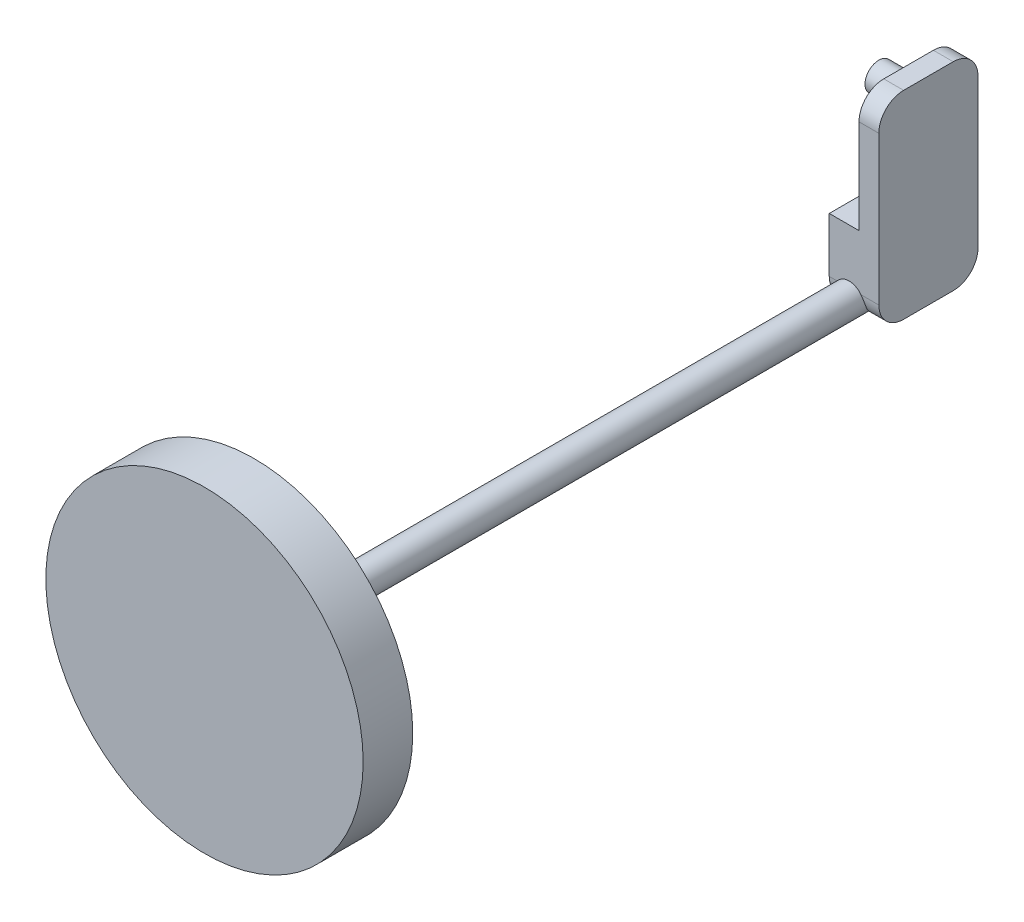
ISO-10303-21;
HEADER;
FILE_DESCRIPTION(('STEP AP214'),'2;1');
FILE_NAME('part.step','',(''),(''),'','','');
FILE_SCHEMA(('AUTOMOTIVE_DESIGN { 1 0 10303 214 1 1 1 1 }'));
ENDSEC;
DATA;
#1=APPLICATION_CONTEXT('core data for automotive mechanical design processes');
#2=APPLICATION_PROTOCOL_DEFINITION('international standard','automotive_design',2000,#1);
#3=PRODUCT_CONTEXT('',#1,'mechanical');
#4=PRODUCT('Part','Part','',(#3));
#5=PRODUCT_RELATED_PRODUCT_CATEGORY('part','',(#4));
#6=PRODUCT_DEFINITION_FORMATION('','',#4);
#7=PRODUCT_DEFINITION_CONTEXT('part definition',#1,'design');
#8=PRODUCT_DEFINITION('design','',#6,#7);
#9=PRODUCT_DEFINITION_SHAPE('','',#8);
#10=(LENGTH_UNIT() NAMED_UNIT(*) SI_UNIT(.MILLI.,.METRE.));
#11=(NAMED_UNIT(*) PLANE_ANGLE_UNIT() SI_UNIT($,.RADIAN.));
#12=(NAMED_UNIT(*) SI_UNIT($,.STERADIAN.) SOLID_ANGLE_UNIT());
#13=UNCERTAINTY_MEASURE_WITH_UNIT(LENGTH_MEASURE(1.E-05),#10,'distance_accuracy_value','');
#14=(GEOMETRIC_REPRESENTATION_CONTEXT(3) GLOBAL_UNCERTAINTY_ASSIGNED_CONTEXT((#13)) GLOBAL_UNIT_ASSIGNED_CONTEXT((#10,
#11,#12)) REPRESENTATION_CONTEXT('',''));
#15=CARTESIAN_POINT('',(0.,0.,0.));
#16=DIRECTION('',(0.,0.,1.));
#17=DIRECTION('',(1.,0.,0.));
#18=AXIS2_PLACEMENT_3D('',#15,#16,#17);
#19=CARTESIAN_POINT('',(25.0000000000001,460.,-1750.));
#20=DIRECTION('',(1.,0.,0.));
#21=DIRECTION('',(0.,1.,0.));
#22=AXIS2_PLACEMENT_3D('',#19,#20,#21);
#23=PLANE('',#22);
#24=CARTESIAN_POINT('',(25.,60.,-1687.5));
#25=DIRECTION('',(1.,0.,0.));
#26=DIRECTION('',(0.,1.,0.));
#27=AXIS2_PLACEMENT_3D('',#24,#25,#26);
#28=CIRCLE('',#27,18.7500000000001);
#29=CARTESIAN_POINT('',(25.,78.7500000000002,-1687.5));
#30=VERTEX_POINT('',#29);
#31=EDGE_CURVE('E190',#30,#30,#28,.F.);
#32=ORIENTED_EDGE('',*,*,#31,.F.);
#33=EDGE_LOOP('',(#32));
#34=FACE_BOUND('',#33,.T.);
#35=DIRECTION('',(0.,1.,0.));
#36=VECTOR('',#35,1.);
#37=CARTESIAN_POINT('',(25.0000000000001,460.,-1750.));
#38=LINE('',#37,#36);
#39=CARTESIAN_POINT('',(25.,22.5,-1750.));
#40=VERTEX_POINT('',#39);
#41=CARTESIAN_POINT('',(25.,397.5,-1750.));
#42=VERTEX_POINT('',#41);
#43=EDGE_CURVE('E160',#40,#42,#38,.T.);
#44=ORIENTED_EDGE('',*,*,#43,.F.);
#45=CARTESIAN_POINT('',(25.,22.5,-1687.5));
#46=DIRECTION('',(1.,0.,0.));
#47=DIRECTION('',(0.,1.,0.));
#48=AXIS2_PLACEMENT_3D('',#45,#46,#47);
#49=CIRCLE('',#48,62.5);
#50=CARTESIAN_POINT('',(25.,-40.,-1687.5));
#51=VERTEX_POINT('',#50);
#52=EDGE_CURVE('E225',#40,#51,#49,.F.);
#53=ORIENTED_EDGE('',*,*,#52,.T.);
#54=DIRECTION('',(0.,0.,1.));
#55=VECTOR('',#54,1.);
#56=CARTESIAN_POINT('',(25.,-40.,-1750.));
#57=LINE('',#56,#55);
#58=CARTESIAN_POINT('',(25.,-40.,-1625.));
#59=VERTEX_POINT('',#58);
#60=EDGE_CURVE('E165',#51,#59,#57,.T.);
#61=ORIENTED_EDGE('',*,*,#60,.T.);
#62=DIRECTION('',(0.,-1.,0.));
#63=VECTOR('',#62,1.);
#64=CARTESIAN_POINT('',(25.,-40.,-1625.));
#65=LINE('',#64,#63);
#66=CARTESIAN_POINT('',(25.,160.,-1625.));
#67=VERTEX_POINT('',#66);
#68=EDGE_CURVE('E138',#67,#59,#65,.T.);
#69=ORIENTED_EDGE('',*,*,#68,.F.);
#70=DIRECTION('',(0.,0.,-1.));
#71=VECTOR('',#70,1.);
#72=CARTESIAN_POINT('',(25.,160.,-1500.));
#73=LINE('',#72,#71);
#74=CARTESIAN_POINT('',(25.,160.,-1500.));
#75=VERTEX_POINT('',#74);
#76=EDGE_CURVE('E298',#75,#67,#73,.T.);
#77=ORIENTED_EDGE('',*,*,#76,.F.);
#78=DIRECTION('',(0.,1.,0.));
#79=VECTOR('',#78,1.);
#80=CARTESIAN_POINT('',(25.0000000000001,460.,-1500.));
#81=LINE('',#80,#79);
#82=CARTESIAN_POINT('',(25.,397.5,-1500.));
#83=VERTEX_POINT('',#82);
#84=EDGE_CURVE('E152',#75,#83,#81,.T.);
#85=ORIENTED_EDGE('',*,*,#84,.T.);
#86=CARTESIAN_POINT('',(25.,397.5,-1562.5));
#87=DIRECTION('',(1.,0.,0.));
#88=DIRECTION('',(0.,1.,0.));
#89=AXIS2_PLACEMENT_3D('',#86,#87,#88);
#90=CIRCLE('',#89,62.5);
#91=CARTESIAN_POINT('',(25.0000000000001,460.,-1562.5));
#92=VERTEX_POINT('',#91);
#93=EDGE_CURVE('E55',#83,#92,#90,.F.);
#94=ORIENTED_EDGE('',*,*,#93,.T.);
#95=DIRECTION('',(0.,0.,1.));
#96=VECTOR('',#95,1.);
#97=CARTESIAN_POINT('',(25.0000000000001,460.,-1750.));
#98=LINE('',#97,#96);
#99=CARTESIAN_POINT('',(25.0000000000001,460.,-1687.5));
#100=VERTEX_POINT('',#99);
#101=EDGE_CURVE('E176',#100,#92,#98,.T.);
#102=ORIENTED_EDGE('',*,*,#101,.F.);
#103=CARTESIAN_POINT('',(25.,397.5,-1687.5));
#104=DIRECTION('',(1.,0.,0.));
#105=DIRECTION('',(0.,1.,0.));
#106=AXIS2_PLACEMENT_3D('',#103,#104,#105);
#107=CIRCLE('',#106,62.5);
#108=EDGE_CURVE('E223',#100,#42,#107,.F.);
#109=ORIENTED_EDGE('',*,*,#108,.T.);
#110=EDGE_LOOP('',(#44,#53,#61,#69,#77,#85,#94,#102,#109));
#111=FACE_BOUND('',#110,.T.);
#112=CARTESIAN_POINT('',(25.,397.09,-1625.));
#113=DIRECTION('',(1.,0.,0.));
#114=DIRECTION('',(0.,1.,0.));
#115=AXIS2_PLACEMENT_3D('',#112,#113,#114);
#116=CIRCLE('',#115,34.9999999999999);
#117=CARTESIAN_POINT('',(25.0000000000001,432.09,-1625.));
#118=VERTEX_POINT('',#117);
#119=EDGE_CURVE('E193',#118,#118,#116,.F.);
#120=ORIENTED_EDGE('',*,*,#119,.F.);
#121=EDGE_LOOP('',(#120));
#122=FACE_BOUND('',#121,.T.);
#123=ADVANCED_FACE('F35',(#34,#111,#122),#23,.F.);
#124=CARTESIAN_POINT('',(0.,0.,0.));
#125=DIRECTION('',(0.,0.,1.));
#126=DIRECTION('',(1.,0.,0.));
#127=AXIS2_PLACEMENT_3D('',#124,#125,#126);
#128=PLANE('',#127);
#129=CARTESIAN_POINT('',(0.,0.,0.));
#130=DIRECTION('',(0.,0.,1.));
#131=DIRECTION('',(1.,0.,0.));
#132=AXIS2_PLACEMENT_3D('',#129,#130,#131);
#133=CIRCLE('',#132,400.);
#134=CARTESIAN_POINT('',(400.,0.,0.));
#135=VERTEX_POINT('',#134);
#136=EDGE_CURVE('E181',#135,#135,#133,.T.);
#137=ORIENTED_EDGE('',*,*,#136,.F.);
#138=EDGE_LOOP('',(#137));
#139=FACE_BOUND('',#138,.T.);
#140=CARTESIAN_POINT('',(0.,0.,0.));
#141=DIRECTION('',(0.,0.,1.));
#142=DIRECTION('',(1.,0.,0.));
#143=AXIS2_PLACEMENT_3D('',#140,#141,#142);
#144=CIRCLE('',#143,37.5);
#145=CARTESIAN_POINT('',(37.5,0.,0.));
#146=VERTEX_POINT('',#145);
#147=EDGE_CURVE('E185',#146,#146,#144,.F.);
#148=ORIENTED_EDGE('',*,*,#147,.F.);
#149=EDGE_LOOP('',(#148));
#150=FACE_BOUND('',#149,.T.);
#151=ADVANCED_FACE('F271',(#139,#150),#128,.F.);
#152=CARTESIAN_POINT('',(0.,0.,125.));
#153=DIRECTION('',(0.,0.,-1.));
#154=DIRECTION('',(-1.,0.,0.));
#155=AXIS2_PLACEMENT_3D('',#152,#153,#154);
#156=CYLINDRICAL_SURFACE('',#155,400.);
#157=CARTESIAN_POINT('',(0.,0.,125.));
#158=DIRECTION('',(0.,0.,1.));
#159=DIRECTION('',(1.,0.,0.));
#160=AXIS2_PLACEMENT_3D('',#157,#158,#159);
#161=CIRCLE('',#160,400.);
#162=CARTESIAN_POINT('',(400.,0.,125.));
#163=VERTEX_POINT('',#162);
#164=EDGE_CURVE('E182',#163,#163,#161,.T.);
#165=ORIENTED_EDGE('',*,*,#164,.F.);
#166=EDGE_LOOP('',(#165));
#167=FACE_BOUND('',#166,.T.);
#168=ORIENTED_EDGE('',*,*,#136,.T.);
#169=EDGE_LOOP('',(#168));
#170=FACE_BOUND('',#169,.T.);
#171=ADVANCED_FACE('F273',(#167,#170),#156,.T.);
#172=CARTESIAN_POINT('',(0.,0.,125.));
#173=DIRECTION('',(0.,0.,1.));
#174=DIRECTION('',(1.,0.,0.));
#175=AXIS2_PLACEMENT_3D('',#172,#173,#174);
#176=PLANE('',#175);
#177=ORIENTED_EDGE('',*,*,#164,.T.);
#178=EDGE_LOOP('',(#177));
#179=FACE_BOUND('',#178,.T.);
#180=ADVANCED_FACE('F268',(#179),#176,.T.);
#181=CARTESIAN_POINT('',(0.,0.,-1500.));
#182=DIRECTION('',(0.,0.,1.));
#183=DIRECTION('',(1.,0.,0.));
#184=AXIS2_PLACEMENT_3D('',#181,#182,#183);
#185=CYLINDRICAL_SURFACE('',#184,37.5);
#186=CARTESIAN_POINT('',(0.,0.,-1500.));
#187=DIRECTION('',(0.,0.,-1.));
#188=DIRECTION('',(-1.,0.,0.));
#189=AXIS2_PLACEMENT_3D('',#186,#187,#188);
#190=CIRCLE('',#189,37.5);
#191=CARTESIAN_POINT('',(-30.,22.5,-1500.));
#192=VERTEX_POINT('',#191);
#193=CARTESIAN_POINT('',(30.,22.5,-1500.));
#194=VERTEX_POINT('',#193);
#195=EDGE_CURVE('E178',#192,#194,#190,.T.);
#196=ORIENTED_EDGE('',*,*,#195,.F.);
#197=CARTESIAN_POINT('',(-30.,22.5,-1500.));
#198=CARTESIAN_POINT('',(-30.2830277402963,22.1226418896093,-1499.99999560788));
#199=CARTESIAN_POINT('',(-30.5589264224861,21.739931196325,-1500.00341754691));
#200=CARTESIAN_POINT('',(-31.0960442442056,20.9644549025037,-1500.01766360351));
#201=CARTESIAN_POINT('',(-31.3572627435669,20.5716888645621,-1500.02848804363));
#202=CARTESIAN_POINT('',(-31.8646314077851,19.7766952409566,-1500.05809206252));
#203=CARTESIAN_POINT('',(-32.1107781509119,19.3744655352438,-1500.07687344015));
#204=CARTESIAN_POINT('',(-32.5875175664519,18.5614084004606,-1500.1228936957));
#205=CARTESIAN_POINT('',(-32.8181104656962,18.1505810968887,-1500.15013245025));
#206=CARTESIAN_POINT('',(-33.4853688594126,16.9074878813422,-1500.24517558679));
#207=CARTESIAN_POINT('',(-33.8983427780615,16.063311094886,-1500.32635187836));
#208=CARTESIAN_POINT('',(-34.658225752377,14.3504507781838,-1500.52759841644));
#209=CARTESIAN_POINT('',(-35.0051426451553,13.4817701691686,-1500.64766404448));
#210=CARTESIAN_POINT('',(-35.6320723767928,11.7250514669539,-1500.92936364992));
#211=CARTESIAN_POINT('',(-35.9119449490466,10.8369769594044,-1501.09108333284));
#212=CARTESIAN_POINT('',(-36.4031847852706,9.05075824393393,-1501.45739909067));
#213=CARTESIAN_POINT('',(-36.6145491427832,8.15261361046032,-1501.66199698408));
#214=CARTESIAN_POINT('',(-36.969050932117,6.35441228510053,-1502.11433152124));
#215=CARTESIAN_POINT('',(-37.1122334407846,5.45435725275189,-1502.36203951539));
#216=CARTESIAN_POINT('',(-37.3320255676991,3.65894624728904,-1502.90014267286));
#217=CARTESIAN_POINT('',(-37.4086355524214,2.76359024833408,-1503.19053760117));
#218=CARTESIAN_POINT('',(-37.4972539305428,0.992443183157557,-1503.80973656853));
#219=CARTESIAN_POINT('',(-37.5098556184161,0.116547642863575,-1504.13815889284));
#220=CARTESIAN_POINT('',(-37.4751037541439,-1.61850233563737,-1504.83353331226));
#221=CARTESIAN_POINT('',(-37.4277518026215,-2.47765722015925,-1505.2004843785));
#222=CARTESIAN_POINT('',(-37.2766067205187,-4.17507291668848,-1505.97071667282));
#223=CARTESIAN_POINT('',(-37.1727744830336,-5.01331883026324,-1506.37402291157));
#224=CARTESIAN_POINT('',(-36.9124788011379,-6.66466241080007,-1507.21409961361));
#225=CARTESIAN_POINT('',(-36.756004891253,-7.47775504201545,-1507.65087671775));
#226=CARTESIAN_POINT('',(-36.4501210932634,-8.82950202482545,-1508.41565783467));
#227=CARTESIAN_POINT('',(-36.3133706116705,-9.37557198337042,-1508.73574499495));
#228=CARTESIAN_POINT('',(-36.0179257478082,-10.4532849419318,-1509.38947168483));
#229=CARTESIAN_POINT('',(-35.8592357907571,-10.9849308254977,-1509.7231084719));
#230=CARTESIAN_POINT('',(-35.3520145420788,-12.5578229128724,-1510.74325708231));
#231=CARTESIAN_POINT('',(-34.9723704773547,-13.576855971869,-1511.44891199542));
#232=CARTESIAN_POINT('',(-34.1394342831506,-15.5531705750891,-1512.90448264888));
#233=CARTESIAN_POINT('',(-33.6860389564623,-16.510362927383,-1513.65445945709));
#234=CARTESIAN_POINT('',(-32.7146238335169,-18.3601400952621,-1515.19096318473));
#235=CARTESIAN_POINT('',(-32.1966030143238,-19.252723887826,-1515.97749068257));
#236=CARTESIAN_POINT('',(-30.9144104320411,-21.2704070534774,-1517.85805095266));
#237=CARTESIAN_POINT('',(-30.1270123299817,-22.369352649361,-1518.96447567978));
#238=CARTESIAN_POINT('',(-28.8793726520209,-23.9306465599078,-1520.65463611748));
#239=CARTESIAN_POINT('',(-28.4522501925279,-24.4367099249897,-1521.2233031133));
#240=CARTESIAN_POINT('',(-27.5770876632547,-25.4202183743368,-1522.36930684359));
#241=CARTESIAN_POINT('',(-27.1290480614999,-25.8976640983823,-1522.94664338388));
#242=CARTESIAN_POINT('',(-26.2126016578798,-26.8248965964236,-1524.10913853271));
#243=CARTESIAN_POINT('',(-25.7441666146365,-27.2746427923984,-1524.69430715671));
#244=CARTESIAN_POINT('',(-24.7883734952078,-28.1461330055592,-1525.87003077102));
#245=CARTESIAN_POINT('',(-24.3010150497229,-28.5678764758227,-1526.46058586627));
#246=CARTESIAN_POINT('',(-23.3081209470279,-29.3835701813693,-1527.64512923496));
#247=CARTESIAN_POINT('',(-22.8025919052084,-29.7775303800704,-1528.23911619416));
#248=CARTESIAN_POINT('',(-21.7734263999333,-30.5381275544856,-1529.42878006766));
#249=CARTESIAN_POINT('',(-21.2497908718795,-30.9047659385975,-1530.02445689319));
#250=CARTESIAN_POINT('',(-19.9993786609116,-31.7335247186081,-1531.42197812006));
#251=CARTESIAN_POINT('',(-19.2651178224018,-32.1846750674615,-1532.22369550385));
#252=CARTESIAN_POINT('',(-18.1372122091725,-32.8249632081015,-1533.42073612928));
#253=CARTESIAN_POINT('',(-17.7567734753638,-33.0323442596832,-1533.81887844982));
#254=CARTESIAN_POINT('',(-16.9865336130084,-33.4349605793145,-1534.6122259277));
#255=CARTESIAN_POINT('',(-16.596732962211,-33.6301964653278,-1535.00743123357));
#256=CARTESIAN_POINT('',(-15.8085031731703,-34.0078155800716,-1535.79221595544));
#257=CARTESIAN_POINT('',(-15.4101098679721,-34.1902422661371,-1536.18181043408));
#258=CARTESIAN_POINT('',(-14.6024657593377,-34.5429033350092,-1536.95518163451));
#259=CARTESIAN_POINT('',(-14.1932157180783,-34.713138570606,-1537.33895876174));
#260=CARTESIAN_POINT('',(-13.3628221020428,-35.0411787128354,-1538.09848818795));
#261=CARTESIAN_POINT('',(-12.9416841051913,-35.1989893217039,-1538.47424410983));
#262=CARTESIAN_POINT('',(-12.0858259242665,-35.501956511884,-1539.21517426913));
#263=CARTESIAN_POINT('',(-11.6511078149525,-35.6471150134552,-1539.58035010669));
#264=CARTESIAN_POINT('',(-10.8594511170038,-35.8950707894862,-1540.22091697465));
#265=CARTESIAN_POINT('',(-10.5054617770135,-36.0003424931613,-1540.49899056235));
#266=CARTESIAN_POINT('',(-9.78655321916746,-36.2023868695126,-1541.04390150359));
#267=CARTESIAN_POINT('',(-9.42163444584671,-36.2991598872298,-1541.31073931306));
#268=CARTESIAN_POINT('',(-8.67836604495312,-36.4840111320178,-1541.83087293492));
#269=CARTESIAN_POINT('',(-8.29997943289465,-36.5720624234023,-1542.08412575183));
#270=CARTESIAN_POINT('',(-7.52927572766957,-36.738473525312,-1542.572137639));
#271=CARTESIAN_POINT('',(-7.13695789383411,-36.8168328195555,-1542.80689572381));
#272=CARTESIAN_POINT('',(-6.32969667478686,-36.9642573650385,-1543.25658373656));
#273=CARTESIAN_POINT('',(-5.91447228162339,-37.0331287044961,-1543.471077823));
#274=CARTESIAN_POINT('',(-5.06692316895651,-37.1585753737403,-1543.86809797706));
#275=CARTESIAN_POINT('',(-4.63459613752356,-37.2151490343708,-1544.05061970445));
#276=CARTESIAN_POINT('',(-3.75566407191048,-37.314063635612,-1544.37387867851));
#277=CARTESIAN_POINT('',(-3.30915709713589,-37.3564857174402,-1544.51485358016));
#278=CARTESIAN_POINT('',(-2.40222195114889,-37.4257324264104,-1544.74692855732));
#279=CARTESIAN_POINT('',(-1.94180708658736,-37.4525714948828,-1544.83807480621));
#280=CARTESIAN_POINT('',(-1.16801207318066,-37.4830869322276,-1544.94206655549));
#281=CARTESIAN_POINT('',(-0.85691462834911,-37.491506568804,-1544.97089987265));
#282=CARTESIAN_POINT('',(-0.233303382939208,-37.5005691775021,-1545.00194268646));
#283=CARTESIAN_POINT('',(0.0792100823132176,-37.5012139034243,-1545.00415818732));
#284=CARTESIAN_POINT('',(0.703329886315355,-37.4947035270938,-1544.98184746765));
#285=CARTESIAN_POINT('',(1.01493572984767,-37.4875447598596,-1544.95730868171));
#286=CARTESIAN_POINT('',(1.6347831419381,-37.4656338913591,-1544.88255861697));
#287=CARTESIAN_POINT('',(1.94302414033071,-37.4508805229909,-1544.83234305419));
#288=CARTESIAN_POINT('',(2.63612800496433,-37.4092427906499,-1544.69159253695));
#289=CARTESIAN_POINT('',(3.0193990896042,-37.3801675698335,-1544.59386058533));
#290=CARTESIAN_POINT('',(3.77510260093428,-37.3114299966365,-1544.36558625519));
#291=CARTESIAN_POINT('',(4.1475288203016,-37.2717617082073,-1544.23502548276));
#292=CARTESIAN_POINT('',(4.88154919146666,-37.1827596575477,-1543.94626561444));
#293=CARTESIAN_POINT('',(5.24310590677173,-37.1333961143797,-1543.78798152714));
#294=CARTESIAN_POINT('',(5.95417806444665,-37.0260323603589,-1543.44919805741));
#295=CARTESIAN_POINT('',(6.30369434978728,-36.9680327556508,-1543.26870023427));
#296=CARTESIAN_POINT('',(7.07336471644142,-36.829401187691,-1542.84464516976));
#297=CARTESIAN_POINT('',(7.49049618855889,-36.7466699504844,-1542.59631261164));
#298=CARTESIAN_POINT('',(8.30920105513574,-36.5702419259318,-1542.07865342364));
#299=CARTESIAN_POINT('',(8.71076811446963,-36.4765407346373,-1541.80931837679));
#300=CARTESIAN_POINT('',(9.50065334367476,-36.2788310865468,-1541.25415330303));
#301=CARTESIAN_POINT('',(9.88894892997522,-36.1748061321782,-1540.96829718971));
#302=CARTESIAN_POINT('',(10.6532053438466,-35.9571555617227,-1540.38421090355));
#303=CARTESIAN_POINT('',(11.0291678168019,-35.8435312335977,-1540.08598239345));
#304=CARTESIAN_POINT('',(11.7723125383759,-35.6063987759867,-1539.47819689198));
#305=CARTESIAN_POINT('',(12.1394339149506,-35.4828389184193,-1539.16858586733));
#306=CARTESIAN_POINT('',(12.8638795790968,-35.2266676158758,-1538.54177364339));
#307=CARTESIAN_POINT('',(13.2212037188728,-35.0940560344557,-1538.22457232973));
#308=CARTESIAN_POINT('',(14.2794354833675,-34.6831495240604,-1537.26469010831));
#309=CARTESIAN_POINT('',(14.9672460631804,-34.3915755405916,-1536.61319515428));
#310=CARTESIAN_POINT('',(16.2942028768555,-33.7826298734548,-1535.31515884197));
#311=CARTESIAN_POINT('',(16.9341763776188,-33.4662258397849,-1534.66900213773));
#312=CARTESIAN_POINT('',(18.1894665669865,-32.8008829438975,-1533.36933967715));
#313=CARTESIAN_POINT('',(18.8047797296938,-32.4519394527986,-1532.7158328869));
#314=CARTESIAN_POINT('',(20.0129329300853,-31.7211482400142,-1531.40529619488));
#315=CARTESIAN_POINT('',(20.6057538126584,-31.3392733401748,-1530.74826381098));
#316=CARTESIAN_POINT('',(21.7691735450593,-30.5425942095171,-1529.43455953738));
#317=CARTESIAN_POINT('',(22.3397735726759,-30.1277917275348,-1528.77788763039));
#318=CARTESIAN_POINT('',(23.4571831585728,-29.2661369099779,-1527.46960209578));
#319=CARTESIAN_POINT('',(24.0040593997749,-28.8193852157412,-1526.81797917912));
#320=CARTESIAN_POINT('',(25.0753735569452,-27.892247282806,-1525.52017516245));
#321=CARTESIAN_POINT('',(25.5998107719219,-27.4118599945714,-1524.87399423294));
#322=CARTESIAN_POINT('',(26.6249620004148,-26.4172502461003,-1523.58969432406));
#323=CARTESIAN_POINT('',(27.1256897607602,-25.9030478156358,-1522.95157083434));
#324=CARTESIAN_POINT('',(28.1022785781729,-24.8401439755898,-1521.6852458936));
#325=CARTESIAN_POINT('',(28.5781416661696,-24.2914453917216,-1521.05704363515));
#326=CARTESIAN_POINT('',(29.7050229794728,-22.9120973576543,-1519.54129123441));
#327=CARTESIAN_POINT('',(30.3419587446549,-22.0628148937015,-1518.66007264044));
#328=CARTESIAN_POINT('',(31.5542605339174,-20.2911464207609,-1516.92915931291));
#329=CARTESIAN_POINT('',(32.1296267157712,-19.3687605991127,-1516.07946449858));
#330=CARTESIAN_POINT('',(33.209988901159,-17.4515413004977,-1514.41953974806));
#331=CARTESIAN_POINT('',(33.7150438631121,-16.4567696006401,-1513.60927712202));
#332=CARTESIAN_POINT('',(34.6453478500079,-14.3954077155656,-1512.0355660069));
#333=CARTESIAN_POINT('',(35.0706154616459,-13.3288343356212,-1511.27210664284));
#334=CARTESIAN_POINT('',(35.7502644697192,-11.3584655860534,-1509.95527008598));
#335=CARTESIAN_POINT('',(36.0217773005013,-10.4675363136927,-1509.39144946639));
#336=CARTESIAN_POINT('',(36.5019136038629,-8.64565959038025,-1508.30292108635));
#337=CARTESIAN_POINT('',(36.7105438847632,-7.7147164842231,-1507.77820909624));
#338=CARTESIAN_POINT('',(37.0584965002085,-5.81778815487953,-1506.77295251213));
#339=CARTESIAN_POINT('',(37.1978866057205,-4.85183819355847,-1506.29236510699));
#340=CARTESIAN_POINT('',(37.4015074410105,-2.88963504299522,-1505.37918744563));
#341=CARTESIAN_POINT('',(37.4657375323134,-1.89338159640246,-1504.94659759716));
#342=CARTESIAN_POINT('',(37.5135354104608,0.130233627822795,-1504.13011715043));
#343=CARTESIAN_POINT('',(37.4964523046447,1.15778078700809,-1503.74664484212));
#344=CARTESIAN_POINT('',(37.3752540919652,3.22714581211328,-1503.03569229552));
#345=CARTESIAN_POINT('',(37.2711378561657,4.26896386297329,-1502.70821278359));
#346=CARTESIAN_POINT('',(36.9723298624495,6.35683028079837,-1502.11103180226));
#347=CARTESIAN_POINT('',(36.7775929065397,7.40288050022012,-1501.84135926282));
#348=CARTESIAN_POINT('',(36.2958745376803,9.48700865535526,-1501.36035803869));
#349=CARTESIAN_POINT('',(36.0089035087312,10.5250874750497,-1501.14902279117));
#350=CARTESIAN_POINT('',(35.3614505586092,12.5243426066538,-1500.79336517039));
#351=CARTESIAN_POINT('',(35.0059555865099,13.4865809993527,-1500.64596499353));
#352=CARTESIAN_POINT('',(34.4126213539252,14.9092628265143,-1500.46081781469));
#353=CARTESIAN_POINT('',(34.2047775473876,15.3801417655665,-1500.40508626942));
#354=CARTESIAN_POINT('',(33.7693806181591,16.3139242677161,-1500.3051228332));
#355=CARTESIAN_POINT('',(33.5418295876753,16.7768286711853,-1500.26088972352));
#356=CARTESIAN_POINT('',(33.0667125399435,17.6949296002719,-1500.18327489182));
#357=CARTESIAN_POINT('',(32.8190886718711,18.1500989182638,-1500.14992603493));
#358=CARTESIAN_POINT('',(32.3048877249461,19.0502733684079,-1500.09364804826));
#359=CARTESIAN_POINT('',(32.0383102884731,19.4952783085669,-1500.07071911514));
#360=CARTESIAN_POINT('',(31.4867896780237,20.3740291130517,-1500.03462129649));
#361=CARTESIAN_POINT('',(31.2018502777071,20.8077772652762,-1500.02145041244));
#362=CARTESIAN_POINT('',(30.6141498505758,21.6631790238701,-1500.00413645473));
#363=CARTESIAN_POINT('',(30.3113898232041,22.0848333065369,-1499.99999287529));
#364=CARTESIAN_POINT('',(30.,22.5,-1500.));
#365=B_SPLINE_CURVE_WITH_KNOTS('',3,(#197,#198,#199,#200,#201,#202,#203,#204,#205,#206,#207,
#208,#209,#210,#211,#212,#213,#214,#215,#216,#217,#218,#219,#220,#221,#222,#223,#224,#225,#226,
#227,#228,#229,#230,#231,#232,#233,#234,#235,#236,#237,#238,#239,#240,#241,#242,#243,#244,#245,
#246,#247,#248,#249,#250,#251,#252,#253,#254,#255,#256,#257,#258,#259,#260,#261,#262,#263,#264,
#265,#266,#267,#268,#269,#270,#271,#272,#273,#274,#275,#276,#277,#278,#279,#280,#281,#282,#283,
#284,#285,#286,#287,#288,#289,#290,#291,#292,#293,#294,#295,#296,#297,#298,#299,#300,#301,#302,
#303,#304,#305,#306,#307,#308,#309,#310,#311,#312,#313,#314,#315,#316,#317,#318,#319,#320,#321,
#322,#323,#324,#325,#326,#327,#328,#329,#330,#331,#332,#333,#334,#335,#336,#337,#338,#339,#340,
#341,#342,#343,#344,#345,#346,#347,#348,#349,#350,#351,#352,#353,#354,#355,#356,#357,#358,#359,
#360,#361,#362,#363,#364),.UNSPECIFIED.,.F.,.F.,(4,2,2,2,2,2,2,2,2,2,2,2,2,2,2,2,2,2,2,2,2,2,2,
2,2,2,2,2,2,2,2,2,2,2,2,2,2,2,2,2,2,2,2,2,2,2,2,2,2,2,2,2,2,2,2,2,2,2,2,2,2,2,2,2,2,2,2,2,2,2,2,
2,2,2,2,2,2,2,2,2,2,2,2,4),(0.,1.41501759637815,2.83009685055583,4.24549618700732,
5.66087487736841,8.48702085932883,11.3128313335858,14.1445031731499,16.9762951305305,
19.8062123061535,22.6361139032553,25.4397365790207,28.2432844061363,31.0487758830125,
33.8548254380279,35.79688243429,37.7385482852742,41.6224674854778,45.5118688024197,
49.4013316912491,54.6339960629855,57.2520590352761,59.8700634559178,62.4918160780694,
65.113619890732,67.7344786607592,70.3552022359353,73.8845868099696,75.6497376964007,
77.4147986957918,79.1735489362577,80.9321760320148,82.6899912496804,84.4475392106135,
85.8341341000298,87.2206726685728,88.6113679164592,90.0021372132291,91.4180815340855,
92.8342179203533,94.2420891190892,95.6486535025797,96.5851603881705,97.5214560202758,
98.4581915816771,99.3950834810126,100.582928471319,101.771440497501,102.963662044937,
104.15579995259,105.632119391131,107.109033551808,108.588347062467,110.06746240572,
111.554850842381,113.042261704589,116.014499199134,118.902337540769,121.790587318665,
124.681243996708,127.571747249984,130.453515527622,133.335373765594,136.215540101498,
139.095470818462,143.230936389683,147.366391363426,151.498357452702,155.62935979006,
158.892654765465,162.155596295486,165.41533779629,168.675106987989,171.961013530142,
175.246962695556,178.534552520539,181.821772347952,184.925829597691,186.478516639535,
188.031039042777,189.588206845689,191.145404037399,192.702282216022,194.259073162515),.UNSPECIFIED.);
#366=EDGE_CURVE('E11',#192,#194,#365,.T.);
#367=ORIENTED_EDGE('',*,*,#366,.T.);
#368=EDGE_LOOP('',(#196,#367));
#369=FACE_BOUND('',#368,.T.);
#370=ORIENTED_EDGE('',*,*,#147,.T.);
#371=EDGE_LOOP('',(#370));
#372=FACE_BOUND('',#371,.T.);
#373=ADVANCED_FACE('F265',(#369,#372),#185,.T.);
#374=CARTESIAN_POINT('',(25.0000000000001,460.,-1750.));
#375=DIRECTION('',(0.,-1.,0.));
#376=DIRECTION('',(0.,0.,-1.));
#377=AXIS2_PLACEMENT_3D('',#374,#375,#376);
#378=PLANE('',#377);
#379=DIRECTION('',(0.,0.,1.));
#380=VECTOR('',#379,1.);
#381=CARTESIAN_POINT('',(75.0000000000001,460.,-1750.));
#382=LINE('',#381,#380);
#383=CARTESIAN_POINT('',(75.0000000000001,460.,-1687.5));
#384=VERTEX_POINT('',#383);
#385=CARTESIAN_POINT('',(75.0000000000001,460.,-1562.5));
#386=VERTEX_POINT('',#385);
#387=EDGE_CURVE('E173',#384,#386,#382,.T.);
#388=ORIENTED_EDGE('',*,*,#387,.F.);
#389=DIRECTION('',(1.,0.,0.));
#390=VECTOR('',#389,1.);
#391=CARTESIAN_POINT('',(25.0000000000001,460.,-1687.5));
#392=LINE('',#391,#390);
#393=EDGE_CURVE('E48',#384,#100,#392,.F.);
#394=ORIENTED_EDGE('',*,*,#393,.T.);
#395=ORIENTED_EDGE('',*,*,#101,.T.);
#396=DIRECTION('',(1.,0.,0.));
#397=VECTOR('',#396,1.);
#398=CARTESIAN_POINT('',(75.0000000000001,460.,-1562.5));
#399=LINE('',#398,#397);
#400=EDGE_CURVE('E227',#92,#386,#399,.T.);
#401=ORIENTED_EDGE('',*,*,#400,.T.);
#402=EDGE_LOOP('',(#388,#394,#395,#401));
#403=FACE_BOUND('',#402,.T.);
#404=ADVANCED_FACE('F230',(#403),#378,.F.);
#405=CARTESIAN_POINT('',(75.0000000000001,460.,-1750.));
#406=DIRECTION('',(-1.,0.,0.));
#407=DIRECTION('',(0.,-1.,0.));
#408=AXIS2_PLACEMENT_3D('',#405,#406,#407);
#409=PLANE('',#408);
#410=DIRECTION('',(0.,-1.,0.));
#411=VECTOR('',#410,1.);
#412=CARTESIAN_POINT('',(75.0000000000001,460.,-1500.));
#413=LINE('',#412,#411);
#414=CARTESIAN_POINT('',(75.0000000000001,397.5,-1500.));
#415=VERTEX_POINT('',#414);
#416=CARTESIAN_POINT('',(75.,22.5,-1500.));
#417=VERTEX_POINT('',#416);
#418=EDGE_CURVE('E154',#415,#417,#413,.T.);
#419=ORIENTED_EDGE('',*,*,#418,.T.);
#420=CARTESIAN_POINT('',(75.,22.5,-1562.5));
#421=DIRECTION('',(-1.,0.,0.));
#422=DIRECTION('',(0.,-1.,0.));
#423=AXIS2_PLACEMENT_3D('',#420,#421,#422);
#424=CIRCLE('',#423,62.5);
#425=CARTESIAN_POINT('',(75.,-40.,-1562.5));
#426=VERTEX_POINT('',#425);
#427=EDGE_CURVE('E214',#417,#426,#424,.F.);
#428=ORIENTED_EDGE('',*,*,#427,.T.);
#429=DIRECTION('',(0.,0.,1.));
#430=VECTOR('',#429,1.);
#431=CARTESIAN_POINT('',(75.,-40.,-1750.));
#432=LINE('',#431,#430);
#433=CARTESIAN_POINT('',(75.,-40.,-1687.5));
#434=VERTEX_POINT('',#433);
#435=EDGE_CURVE('E170',#434,#426,#432,.T.);
#436=ORIENTED_EDGE('',*,*,#435,.F.);
#437=CARTESIAN_POINT('',(75.,22.5,-1687.5));
#438=DIRECTION('',(-1.,0.,0.));
#439=DIRECTION('',(0.,-1.,0.));
#440=AXIS2_PLACEMENT_3D('',#437,#438,#439);
#441=CIRCLE('',#440,62.5);
#442=CARTESIAN_POINT('',(75.,22.5,-1750.));
#443=VERTEX_POINT('',#442);
#444=EDGE_CURVE('E212',#434,#443,#441,.F.);
#445=ORIENTED_EDGE('',*,*,#444,.T.);
#446=DIRECTION('',(0.,-1.,0.));
#447=VECTOR('',#446,1.);
#448=CARTESIAN_POINT('',(75.0000000000001,460.,-1750.));
#449=LINE('',#448,#447);
#450=CARTESIAN_POINT('',(75.0000000000001,397.5,-1750.));
#451=VERTEX_POINT('',#450);
#452=EDGE_CURVE('E163',#451,#443,#449,.T.);
#453=ORIENTED_EDGE('',*,*,#452,.F.);
#454=CARTESIAN_POINT('',(75.0000000000001,397.5,-1687.5));
#455=DIRECTION('',(-1.,0.,0.));
#456=DIRECTION('',(0.,-1.,0.));
#457=AXIS2_PLACEMENT_3D('',#454,#455,#456);
#458=CIRCLE('',#457,62.5);
#459=EDGE_CURVE('E210',#451,#384,#458,.F.);
#460=ORIENTED_EDGE('',*,*,#459,.T.);
#461=ORIENTED_EDGE('',*,*,#387,.T.);
#462=CARTESIAN_POINT('',(75.0000000000001,397.5,-1562.5));
#463=DIRECTION('',(-1.,0.,0.));
#464=DIRECTION('',(0.,-1.,0.));
#465=AXIS2_PLACEMENT_3D('',#462,#463,#464);
#466=CIRCLE('',#465,62.5);
#467=EDGE_CURVE('E208',#386,#415,#466,.F.);
#468=ORIENTED_EDGE('',*,*,#467,.T.);
#469=EDGE_LOOP('',(#419,#428,#436,#445,#453,#460,#461,#468));
#470=FACE_BOUND('',#469,.T.);
#471=ADVANCED_FACE('F233',(#470),#409,.F.);
#472=CARTESIAN_POINT('',(25.,-40.,-1750.));
#473=DIRECTION('',(0.,1.,0.));
#474=DIRECTION('',(-1.,0.,0.));
#475=AXIS2_PLACEMENT_3D('',#472,#473,#474);
#476=PLANE('',#475);
#477=ORIENTED_EDGE('',*,*,#435,.T.);
#478=DIRECTION('',(-1.,0.,0.));
#479=VECTOR('',#478,1.);
#480=CARTESIAN_POINT('',(-50.,-40.,-1562.5));
#481=LINE('',#480,#479);
#482=CARTESIAN_POINT('',(-50.,-40.,-1562.5));
#483=VERTEX_POINT('',#482);
#484=EDGE_CURVE('E198',#426,#483,#481,.T.);
#485=ORIENTED_EDGE('',*,*,#484,.T.);
#486=DIRECTION('',(0.,0.,1.));
#487=VECTOR('',#486,1.);
#488=CARTESIAN_POINT('',(-50.,-40.,-1500.));
#489=LINE('',#488,#487);
#490=CARTESIAN_POINT('',(-50.,-40.,-1625.));
#491=VERTEX_POINT('',#490);
#492=EDGE_CURVE('E306',#491,#483,#489,.T.);
#493=ORIENTED_EDGE('',*,*,#492,.F.);
#494=DIRECTION('',(1.,0.,0.));
#495=VECTOR('',#494,1.);
#496=CARTESIAN_POINT('',(-50.,-40.,-1625.));
#497=LINE('',#496,#495);
#498=EDGE_CURVE('E156',#491,#59,#497,.T.);
#499=ORIENTED_EDGE('',*,*,#498,.T.);
#500=ORIENTED_EDGE('',*,*,#60,.F.);
#501=DIRECTION('',(-1.,0.,0.));
#502=VECTOR('',#501,1.);
#503=CARTESIAN_POINT('',(25.,-40.,-1687.5));
#504=LINE('',#503,#502);
#505=EDGE_CURVE('E196',#51,#434,#504,.F.);
#506=ORIENTED_EDGE('',*,*,#505,.T.);
#507=EDGE_LOOP('',(#477,#485,#493,#499,#500,#506));
#508=FACE_BOUND('',#507,.T.);
#509=ADVANCED_FACE('F251',(#508),#476,.F.);
#510=CARTESIAN_POINT('',(0.,0.,-1750.));
#511=DIRECTION('',(0.,0.,1.));
#512=DIRECTION('',(1.,0.,0.));
#513=AXIS2_PLACEMENT_3D('',#510,#511,#512);
#514=PLANE('',#513);
#515=ORIENTED_EDGE('',*,*,#452,.T.);
#516=DIRECTION('',(-1.,0.,0.));
#517=VECTOR('',#516,1.);
#518=CARTESIAN_POINT('',(0.,22.5,-1750.));
#519=LINE('',#518,#517);
#520=EDGE_CURVE('E219',#443,#40,#519,.T.);
#521=ORIENTED_EDGE('',*,*,#520,.T.);
#522=ORIENTED_EDGE('',*,*,#43,.T.);
#523=DIRECTION('',(1.,0.,0.));
#524=VECTOR('',#523,1.);
#525=CARTESIAN_POINT('',(0.,397.5,-1750.));
#526=LINE('',#525,#524);
#527=EDGE_CURVE('E216',#42,#451,#526,.T.);
#528=ORIENTED_EDGE('',*,*,#527,.T.);
#529=EDGE_LOOP('',(#515,#521,#522,#528));
#530=FACE_BOUND('',#529,.T.);
#531=ADVANCED_FACE('F241',(#530),#514,.F.);
#532=CARTESIAN_POINT('',(0.,0.,-1500.));
#533=DIRECTION('',(0.,0.,1.));
#534=DIRECTION('',(1.,0.,0.));
#535=AXIS2_PLACEMENT_3D('',#532,#533,#534);
#536=PLANE('',#535);
#537=DIRECTION('',(0.,1.,0.));
#538=VECTOR('',#537,1.);
#539=CARTESIAN_POINT('',(-50.,-40.,-1500.));
#540=LINE('',#539,#538);
#541=CARTESIAN_POINT('',(-50.,22.5,-1500.));
#542=VERTEX_POINT('',#541);
#543=CARTESIAN_POINT('',(-50.,160.,-1500.));
#544=VERTEX_POINT('',#543);
#545=EDGE_CURVE('E128',#542,#544,#540,.T.);
#546=ORIENTED_EDGE('',*,*,#545,.F.);
#547=DIRECTION('',(-1.,0.,0.));
#548=VECTOR('',#547,1.);
#549=CARTESIAN_POINT('',(75.,22.5,-1500.));
#550=LINE('',#549,#548);
#551=EDGE_CURVE('E206',#542,#192,#550,.F.);
#552=ORIENTED_EDGE('',*,*,#551,.T.);
#553=ORIENTED_EDGE('',*,*,#195,.T.);
#554=DIRECTION('',(-1.,0.,0.));
#555=VECTOR('',#554,1.);
#556=CARTESIAN_POINT('',(75.,22.5,-1500.));
#557=LINE('',#556,#555);
#558=EDGE_CURVE('E204',#194,#417,#557,.F.);
#559=ORIENTED_EDGE('',*,*,#558,.T.);
#560=ORIENTED_EDGE('',*,*,#418,.F.);
#561=DIRECTION('',(1.,0.,0.));
#562=VECTOR('',#561,1.);
#563=CARTESIAN_POINT('',(25.0000000000001,397.5,-1500.));
#564=LINE('',#563,#562);
#565=EDGE_CURVE('E202',#415,#83,#564,.F.);
#566=ORIENTED_EDGE('',*,*,#565,.T.);
#567=ORIENTED_EDGE('',*,*,#84,.F.);
#568=DIRECTION('',(1.,0.,0.));
#569=VECTOR('',#568,1.);
#570=CARTESIAN_POINT('',(-50.,160.,-1500.));
#571=LINE('',#570,#569);
#572=EDGE_CURVE('E144',#544,#75,#571,.T.);
#573=ORIENTED_EDGE('',*,*,#572,.F.);
#574=EDGE_LOOP('',(#546,#552,#553,#559,#560,#566,#567,#573));
#575=FACE_BOUND('',#574,.T.);
#576=ADVANCED_FACE('F151',(#575),#536,.T.);
#577=CARTESIAN_POINT('',(-50.,160.,-1500.));
#578=DIRECTION('',(0.,-1.,0.));
#579=DIRECTION('',(1.,0.,0.));
#580=AXIS2_PLACEMENT_3D('',#577,#578,#579);
#581=PLANE('',#580);
#582=ORIENTED_EDGE('',*,*,#76,.T.);
#583=DIRECTION('',(1.,0.,0.));
#584=VECTOR('',#583,1.);
#585=CARTESIAN_POINT('',(-50.,160.,-1625.));
#586=LINE('',#585,#584);
#587=CARTESIAN_POINT('',(-50.,160.,-1625.));
#588=VERTEX_POINT('',#587);
#589=EDGE_CURVE('E146',#588,#67,#586,.T.);
#590=ORIENTED_EDGE('',*,*,#589,.F.);
#591=DIRECTION('',(0.,0.,-1.));
#592=VECTOR('',#591,1.);
#593=CARTESIAN_POINT('',(-50.,160.,-1500.));
#594=LINE('',#593,#592);
#595=EDGE_CURVE('E132',#544,#588,#594,.T.);
#596=ORIENTED_EDGE('',*,*,#595,.F.);
#597=ORIENTED_EDGE('',*,*,#572,.T.);
#598=EDGE_LOOP('',(#582,#590,#596,#597));
#599=FACE_BOUND('',#598,.T.);
#600=ADVANCED_FACE('F143',(#599),#581,.F.);
#601=CARTESIAN_POINT('',(-50.,-40.,-1625.));
#602=DIRECTION('',(0.,0.,1.));
#603=DIRECTION('',(1.,0.,0.));
#604=AXIS2_PLACEMENT_3D('',#601,#602,#603);
#605=PLANE('',#604);
#606=ORIENTED_EDGE('',*,*,#68,.T.);
#607=ORIENTED_EDGE('',*,*,#498,.F.);
#608=DIRECTION('',(0.,-1.,0.));
#609=VECTOR('',#608,1.);
#610=CARTESIAN_POINT('',(-50.,-40.,-1625.));
#611=LINE('',#610,#609);
#612=EDGE_CURVE('E148',#588,#491,#611,.T.);
#613=ORIENTED_EDGE('',*,*,#612,.F.);
#614=ORIENTED_EDGE('',*,*,#589,.T.);
#615=EDGE_LOOP('',(#606,#607,#613,#614));
#616=FACE_BOUND('',#615,.T.);
#617=ADVANCED_FACE('F333',(#616),#605,.F.);
#618=CARTESIAN_POINT('',(-50.,0.,0.));
#619=DIRECTION('',(-1.,0.,0.));
#620=DIRECTION('',(0.,-1.,0.));
#621=AXIS2_PLACEMENT_3D('',#618,#619,#620);
#622=PLANE('',#621);
#623=ORIENTED_EDGE('',*,*,#492,.T.);
#624=CARTESIAN_POINT('',(-50.,22.5,-1562.5));
#625=DIRECTION('',(-1.,0.,0.));
#626=DIRECTION('',(0.,-1.,0.));
#627=AXIS2_PLACEMENT_3D('',#624,#625,#626);
#628=CIRCLE('',#627,62.5);
#629=EDGE_CURVE('E134',#483,#542,#628,.T.);
#630=ORIENTED_EDGE('',*,*,#629,.T.);
#631=ORIENTED_EDGE('',*,*,#545,.T.);
#632=ORIENTED_EDGE('',*,*,#595,.T.);
#633=ORIENTED_EDGE('',*,*,#612,.T.);
#634=EDGE_LOOP('',(#623,#630,#631,#632,#633));
#635=FACE_BOUND('',#634,.T.);
#636=ADVANCED_FACE('F131',(#635),#622,.T.);
#637=CARTESIAN_POINT('',(-50.,60.,-1687.5));
#638=DIRECTION('',(1.,0.,0.));
#639=DIRECTION('',(0.,1.,0.));
#640=AXIS2_PLACEMENT_3D('',#637,#638,#639);
#641=CYLINDRICAL_SURFACE('',#640,18.7500000000001);
#642=CARTESIAN_POINT('',(-50.,60.,-1687.5));
#643=DIRECTION('',(-1.,0.,0.));
#644=DIRECTION('',(0.,-1.,0.));
#645=AXIS2_PLACEMENT_3D('',#642,#643,#644);
#646=CIRCLE('',#645,18.7500000000001);
#647=CARTESIAN_POINT('',(-50.,41.2499999999999,-1687.5));
#648=VERTEX_POINT('',#647);
#649=EDGE_CURVE('E299',#648,#648,#646,.T.);
#650=ORIENTED_EDGE('',*,*,#649,.F.);
#651=EDGE_LOOP('',(#650));
#652=FACE_BOUND('',#651,.T.);
#653=ORIENTED_EDGE('',*,*,#31,.T.);
#654=EDGE_LOOP('',(#653));
#655=FACE_BOUND('',#654,.T.);
#656=ADVANCED_FACE('F324',(#652,#655),#641,.T.);
#657=CARTESIAN_POINT('',(-50.,60.,-1687.5));
#658=DIRECTION('',(-1.,0.,0.));
#659=DIRECTION('',(0.,-1.,0.));
#660=AXIS2_PLACEMENT_3D('',#657,#658,#659);
#661=PLANE('',#660);
#662=ORIENTED_EDGE('',*,*,#649,.T.);
#663=EDGE_LOOP('',(#662));
#664=FACE_BOUND('',#663,.T.);
#665=ADVANCED_FACE('F316',(#664),#661,.T.);
#666=CARTESIAN_POINT('',(-50.,397.09,-1625.));
#667=DIRECTION('',(1.,0.,0.));
#668=DIRECTION('',(0.,1.,0.));
#669=AXIS2_PLACEMENT_3D('',#666,#667,#668);
#670=CYLINDRICAL_SURFACE('',#669,34.9999999999999);
#671=CARTESIAN_POINT('',(-50.,397.09,-1625.));
#672=DIRECTION('',(-1.,0.,0.));
#673=DIRECTION('',(0.,-1.,0.));
#674=AXIS2_PLACEMENT_3D('',#671,#672,#673);
#675=CIRCLE('',#674,34.9999999999999);
#676=CARTESIAN_POINT('',(-50.,362.09,-1625.));
#677=VERTEX_POINT('',#676);
#678=EDGE_CURVE('E303',#677,#677,#675,.T.);
#679=ORIENTED_EDGE('',*,*,#678,.F.);
#680=EDGE_LOOP('',(#679));
#681=FACE_BOUND('',#680,.T.);
#682=ORIENTED_EDGE('',*,*,#119,.T.);
#683=EDGE_LOOP('',(#682));
#684=FACE_BOUND('',#683,.T.);
#685=ADVANCED_FACE('F313',(#681,#684),#670,.T.);
#686=CARTESIAN_POINT('',(-50.,397.09,-1625.));
#687=DIRECTION('',(-1.,0.,0.));
#688=DIRECTION('',(0.,-1.,0.));
#689=AXIS2_PLACEMENT_3D('',#686,#687,#688);
#690=PLANE('',#689);
#691=ORIENTED_EDGE('',*,*,#678,.T.);
#692=EDGE_LOOP('',(#691));
#693=FACE_BOUND('',#692,.T.);
#694=ADVANCED_FACE('F289',(#693),#690,.T.);
#695=CARTESIAN_POINT('',(25.,22.5,-1562.5));
#696=DIRECTION('',(1.,0.,0.));
#697=DIRECTION('',(0.,1.,0.));
#698=AXIS2_PLACEMENT_3D('',#695,#696,#697);
#699=CYLINDRICAL_SURFACE('',#698,62.5);
#700=ORIENTED_EDGE('',*,*,#366,.F.);
#701=ORIENTED_EDGE('',*,*,#551,.F.);
#702=ORIENTED_EDGE('',*,*,#629,.F.);
#703=ORIENTED_EDGE('',*,*,#484,.F.);
#704=ORIENTED_EDGE('',*,*,#427,.F.);
#705=ORIENTED_EDGE('',*,*,#558,.F.);
#706=EDGE_LOOP('',(#700,#701,#702,#703,#704,#705));
#707=FACE_BOUND('',#706,.T.);
#708=ADVANCED_FACE('F261',(#707),#699,.T.);
#709=CARTESIAN_POINT('',(0.,22.5,-1687.5));
#710=DIRECTION('',(-1.,0.,0.));
#711=DIRECTION('',(0.,-1.,0.));
#712=AXIS2_PLACEMENT_3D('',#709,#710,#711);
#713=CYLINDRICAL_SURFACE('',#712,62.5);
#714=ORIENTED_EDGE('',*,*,#444,.F.);
#715=ORIENTED_EDGE('',*,*,#505,.F.);
#716=ORIENTED_EDGE('',*,*,#52,.F.);
#717=ORIENTED_EDGE('',*,*,#520,.F.);
#718=EDGE_LOOP('',(#714,#715,#716,#717));
#719=FACE_BOUND('',#718,.T.);
#720=ADVANCED_FACE('F256',(#719),#713,.T.);
#721=CARTESIAN_POINT('',(0.,397.5,-1687.5));
#722=DIRECTION('',(1.,0.,0.));
#723=DIRECTION('',(0.,0.,-1.));
#724=AXIS2_PLACEMENT_3D('',#721,#722,#723);
#725=CYLINDRICAL_SURFACE('',#724,62.5);
#726=ORIENTED_EDGE('',*,*,#108,.F.);
#727=ORIENTED_EDGE('',*,*,#393,.F.);
#728=ORIENTED_EDGE('',*,*,#459,.F.);
#729=ORIENTED_EDGE('',*,*,#527,.F.);
#730=EDGE_LOOP('',(#726,#727,#728,#729));
#731=FACE_BOUND('',#730,.T.);
#732=ADVANCED_FACE('F239',(#731),#725,.T.);
#733=CARTESIAN_POINT('',(25.0000000000001,397.5,-1562.5));
#734=DIRECTION('',(-1.,0.,0.));
#735=DIRECTION('',(0.,0.,1.));
#736=AXIS2_PLACEMENT_3D('',#733,#734,#735);
#737=CYLINDRICAL_SURFACE('',#736,62.5);
#738=ORIENTED_EDGE('',*,*,#93,.F.);
#739=ORIENTED_EDGE('',*,*,#565,.F.);
#740=ORIENTED_EDGE('',*,*,#467,.F.);
#741=ORIENTED_EDGE('',*,*,#400,.F.);
#742=EDGE_LOOP('',(#738,#739,#740,#741));
#743=FACE_BOUND('',#742,.T.);
#744=ADVANCED_FACE('F37',(#743),#737,.T.);
#745=CLOSED_SHELL('',(#123,#151,#171,#180,#373,#404,#471,#509,#531,#576,#600,#617,#636,#656,
#665,#685,#694,#708,#720,#732,#744));
#746=MANIFOLD_SOLID_BREP('B2',#745);
#747=ADVANCED_BREP_SHAPE_REPRESENTATION('',(#18,#746),#14);
#748=SHAPE_DEFINITION_REPRESENTATION(#9,#747);
ENDSEC;
END-ISO-10303-21;
